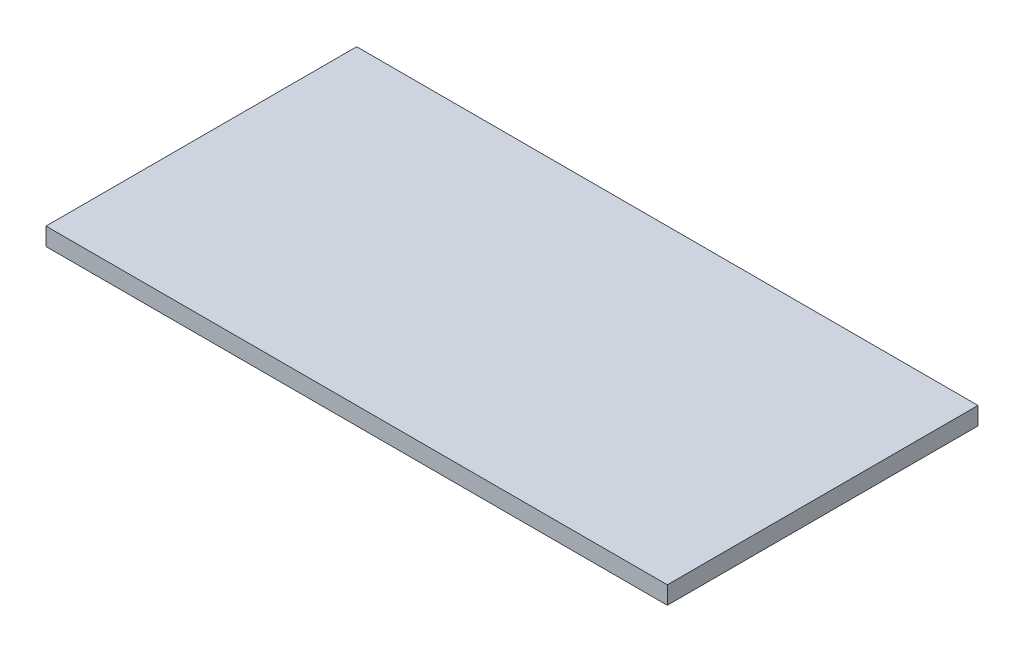
ISO-10303-21;
HEADER;
FILE_DESCRIPTION(('STEP AP214'),'2;1');
FILE_NAME('part.step','',(''),(''),'','','');
FILE_SCHEMA(('AUTOMOTIVE_DESIGN { 1 0 10303 214 1 1 1 1 }'));
ENDSEC;
DATA;
#1=APPLICATION_CONTEXT('core data for automotive mechanical design processes');
#2=APPLICATION_PROTOCOL_DEFINITION('international standard','automotive_design',2000,#1);
#3=PRODUCT_CONTEXT('',#1,'mechanical');
#4=PRODUCT('Part','Part','',(#3));
#5=PRODUCT_RELATED_PRODUCT_CATEGORY('part','',(#4));
#6=PRODUCT_DEFINITION_FORMATION('','',#4);
#7=PRODUCT_DEFINITION_CONTEXT('part definition',#1,'design');
#8=PRODUCT_DEFINITION('design','',#6,#7);
#9=PRODUCT_DEFINITION_SHAPE('','',#8);
#10=(LENGTH_UNIT() NAMED_UNIT(*) SI_UNIT(.MILLI.,.METRE.));
#11=(NAMED_UNIT(*) PLANE_ANGLE_UNIT() SI_UNIT($,.RADIAN.));
#12=(NAMED_UNIT(*) SI_UNIT($,.STERADIAN.) SOLID_ANGLE_UNIT());
#13=UNCERTAINTY_MEASURE_WITH_UNIT(LENGTH_MEASURE(1.E-05),#10,'distance_accuracy_value','');
#14=(GEOMETRIC_REPRESENTATION_CONTEXT(3) GLOBAL_UNCERTAINTY_ASSIGNED_CONTEXT((#13)) GLOBAL_UNIT_ASSIGNED_CONTEXT((#10,
#11,#12)) REPRESENTATION_CONTEXT('',''));
#15=CARTESIAN_POINT('',(0.,0.,0.));
#16=DIRECTION('',(0.,0.,1.));
#17=DIRECTION('',(1.,0.,0.));
#18=AXIS2_PLACEMENT_3D('',#15,#16,#17);
#19=CARTESIAN_POINT('',(0.,2.54,0.));
#20=DIRECTION('',(1.,0.,0.));
#21=DIRECTION('',(0.,0.,-1.));
#22=AXIS2_PLACEMENT_3D('',#19,#20,#21);
#23=PLANE('',#22);
#24=DIRECTION('',(0.,0.,1.));
#25=VECTOR('',#24,1.);
#26=CARTESIAN_POINT('',(0.,0.,0.));
#27=LINE('',#26,#25);
#28=CARTESIAN_POINT('',(0.,0.,-44.45));
#29=VERTEX_POINT('',#28);
#30=CARTESIAN_POINT('',(0.,0.,0.));
#31=VERTEX_POINT('',#30);
#32=EDGE_CURVE('E98',#29,#31,#27,.T.);
#33=ORIENTED_EDGE('',*,*,#32,.T.);
#34=DIRECTION('',(0.,-1.,0.));
#35=VECTOR('',#34,1.);
#36=CARTESIAN_POINT('',(0.,2.54,0.));
#37=LINE('',#36,#35);
#38=CARTESIAN_POINT('',(0.,2.54,0.));
#39=VERTEX_POINT('',#38);
#40=EDGE_CURVE('E11',#39,#31,#37,.T.);
#41=ORIENTED_EDGE('',*,*,#40,.F.);
#42=DIRECTION('',(0.,0.,1.));
#43=VECTOR('',#42,1.);
#44=CARTESIAN_POINT('',(0.,2.54,0.));
#45=LINE('',#44,#43);
#46=CARTESIAN_POINT('',(0.,2.54,-44.45));
#47=VERTEX_POINT('',#46);
#48=EDGE_CURVE('E86',#47,#39,#45,.T.);
#49=ORIENTED_EDGE('',*,*,#48,.F.);
#50=DIRECTION('',(0.,-1.,0.));
#51=VECTOR('',#50,1.);
#52=CARTESIAN_POINT('',(0.,2.54,-44.45));
#53=LINE('',#52,#51);
#54=EDGE_CURVE('E94',#47,#29,#53,.T.);
#55=ORIENTED_EDGE('',*,*,#54,.T.);
#56=EDGE_LOOP('',(#33,#41,#49,#55));
#57=FACE_BOUND('',#56,.T.);
#58=ADVANCED_FACE('F35',(#57),#23,.F.);
#59=CARTESIAN_POINT('',(0.,2.54,0.));
#60=DIRECTION('',(0.,0.,-1.));
#61=DIRECTION('',(-1.,0.,0.));
#62=AXIS2_PLACEMENT_3D('',#59,#60,#61);
#63=PLANE('',#62);
#64=DIRECTION('',(1.,0.,0.));
#65=VECTOR('',#64,1.);
#66=CARTESIAN_POINT('',(0.,0.,0.));
#67=LINE('',#66,#65);
#68=CARTESIAN_POINT('',(88.9,0.,0.));
#69=VERTEX_POINT('',#68);
#70=EDGE_CURVE('E90',#31,#69,#67,.T.);
#71=ORIENTED_EDGE('',*,*,#70,.T.);
#72=DIRECTION('',(0.,-1.,0.));
#73=VECTOR('',#72,1.);
#74=CARTESIAN_POINT('',(88.9,2.54,0.));
#75=LINE('',#74,#73);
#76=CARTESIAN_POINT('',(88.9,2.54,0.));
#77=VERTEX_POINT('',#76);
#78=EDGE_CURVE('E43',#77,#69,#75,.T.);
#79=ORIENTED_EDGE('',*,*,#78,.F.);
#80=DIRECTION('',(1.,0.,0.));
#81=VECTOR('',#80,1.);
#82=CARTESIAN_POINT('',(0.,2.54,0.));
#83=LINE('',#82,#81);
#84=EDGE_CURVE('E81',#39,#77,#83,.T.);
#85=ORIENTED_EDGE('',*,*,#84,.F.);
#86=ORIENTED_EDGE('',*,*,#40,.T.);
#87=EDGE_LOOP('',(#71,#79,#85,#86));
#88=FACE_BOUND('',#87,.T.);
#89=ADVANCED_FACE('F89',(#88),#63,.F.);
#90=CARTESIAN_POINT('',(88.9,2.54,0.));
#91=DIRECTION('',(-1.,0.,0.));
#92=DIRECTION('',(0.,0.,1.));
#93=AXIS2_PLACEMENT_3D('',#90,#91,#92);
#94=PLANE('',#93);
#95=DIRECTION('',(0.,0.,-1.));
#96=VECTOR('',#95,1.);
#97=CARTESIAN_POINT('',(88.9,0.,0.));
#98=LINE('',#97,#96);
#99=CARTESIAN_POINT('',(88.9,0.,-44.45));
#100=VERTEX_POINT('',#99);
#101=EDGE_CURVE('E68',#69,#100,#98,.T.);
#102=ORIENTED_EDGE('',*,*,#101,.T.);
#103=DIRECTION('',(0.,-1.,0.));
#104=VECTOR('',#103,1.);
#105=CARTESIAN_POINT('',(88.9,2.54,-44.45));
#106=LINE('',#105,#104);
#107=CARTESIAN_POINT('',(88.9,2.54,-44.45));
#108=VERTEX_POINT('',#107);
#109=EDGE_CURVE('E91',#108,#100,#106,.T.);
#110=ORIENTED_EDGE('',*,*,#109,.F.);
#111=DIRECTION('',(0.,0.,-1.));
#112=VECTOR('',#111,1.);
#113=CARTESIAN_POINT('',(88.9,2.54,0.));
#114=LINE('',#113,#112);
#115=EDGE_CURVE('E84',#77,#108,#114,.T.);
#116=ORIENTED_EDGE('',*,*,#115,.F.);
#117=ORIENTED_EDGE('',*,*,#78,.T.);
#118=EDGE_LOOP('',(#102,#110,#116,#117));
#119=FACE_BOUND('',#118,.T.);
#120=ADVANCED_FACE('F92',(#119),#94,.F.);
#121=CARTESIAN_POINT('',(0.,2.54,-44.45));
#122=DIRECTION('',(0.,0.,1.));
#123=DIRECTION('',(1.,0.,0.));
#124=AXIS2_PLACEMENT_3D('',#121,#122,#123);
#125=PLANE('',#124);
#126=DIRECTION('',(-1.,0.,0.));
#127=VECTOR('',#126,1.);
#128=CARTESIAN_POINT('',(0.,0.,-44.45));
#129=LINE('',#128,#127);
#130=EDGE_CURVE('E74',#100,#29,#129,.T.);
#131=ORIENTED_EDGE('',*,*,#130,.T.);
#132=ORIENTED_EDGE('',*,*,#54,.F.);
#133=DIRECTION('',(-1.,0.,0.));
#134=VECTOR('',#133,1.);
#135=CARTESIAN_POINT('',(0.,2.54,-44.45));
#136=LINE('',#135,#134);
#137=EDGE_CURVE('E51',#108,#47,#136,.T.);
#138=ORIENTED_EDGE('',*,*,#137,.F.);
#139=ORIENTED_EDGE('',*,*,#109,.T.);
#140=EDGE_LOOP('',(#131,#132,#138,#139));
#141=FACE_BOUND('',#140,.T.);
#142=ADVANCED_FACE('F105',(#141),#125,.F.);
#143=CARTESIAN_POINT('',(0.,2.54,0.));
#144=DIRECTION('',(0.,-1.,0.));
#145=DIRECTION('',(0.,0.,-1.));
#146=AXIS2_PLACEMENT_3D('',#143,#144,#145);
#147=PLANE('',#146);
#148=ORIENTED_EDGE('',*,*,#48,.T.);
#149=ORIENTED_EDGE('',*,*,#84,.T.);
#150=ORIENTED_EDGE('',*,*,#115,.T.);
#151=ORIENTED_EDGE('',*,*,#137,.T.);
#152=EDGE_LOOP('',(#148,#149,#150,#151));
#153=FACE_BOUND('',#152,.T.);
#154=ADVANCED_FACE('F82',(#153),#147,.F.);
#155=CARTESIAN_POINT('',(0.,0.,0.));
#156=DIRECTION('',(0.,-1.,0.));
#157=DIRECTION('',(0.,0.,-1.));
#158=AXIS2_PLACEMENT_3D('',#155,#156,#157);
#159=PLANE('',#158);
#160=ORIENTED_EDGE('',*,*,#32,.F.);
#161=ORIENTED_EDGE('',*,*,#130,.F.);
#162=ORIENTED_EDGE('',*,*,#101,.F.);
#163=ORIENTED_EDGE('',*,*,#70,.F.);
#164=EDGE_LOOP('',(#160,#161,#162,#163));
#165=FACE_BOUND('',#164,.T.);
#166=ADVANCED_FACE('F108',(#165),#159,.T.);
#167=CLOSED_SHELL('',(#58,#89,#120,#142,#154,#166));
#168=MANIFOLD_SOLID_BREP('B2',#167);
#169=ADVANCED_BREP_SHAPE_REPRESENTATION('',(#18,#168),#14);
#170=SHAPE_DEFINITION_REPRESENTATION(#9,#169);
ENDSEC;
END-ISO-10303-21;
